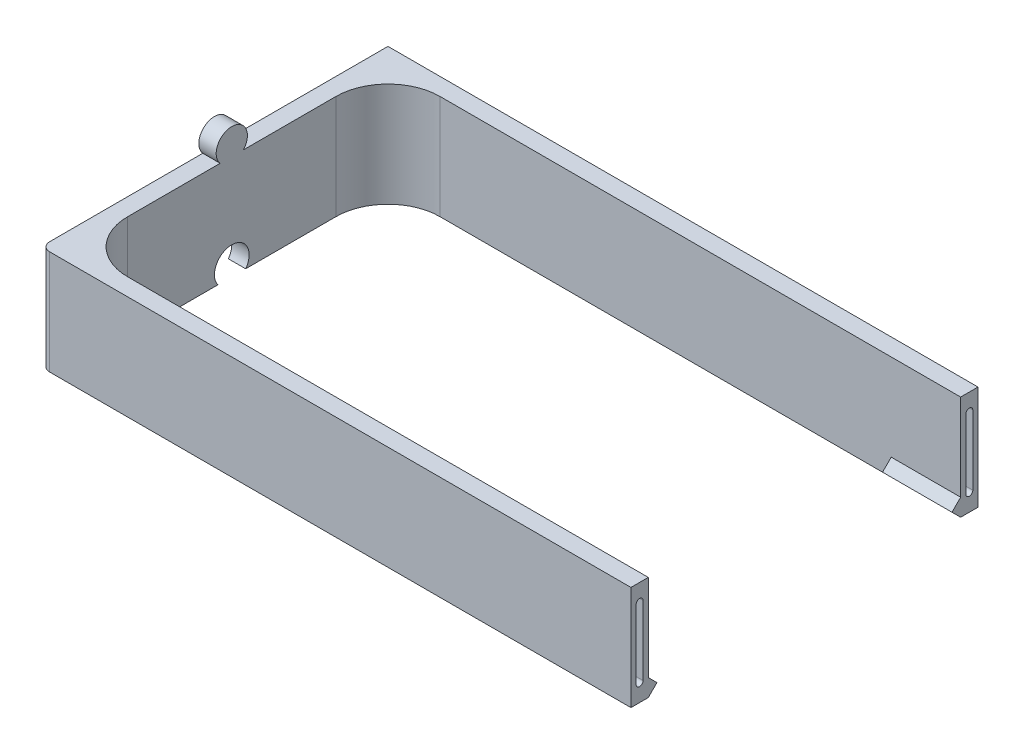
ISO-10303-21;
HEADER;
FILE_DESCRIPTION(('STEP AP214'),'2;1');
FILE_NAME('part.step','',(''),(''),'','','');
FILE_SCHEMA(('AUTOMOTIVE_DESIGN { 1 0 10303 214 1 1 1 1 }'));
ENDSEC;
DATA;
#1=APPLICATION_CONTEXT('core data for automotive mechanical design processes');
#2=APPLICATION_PROTOCOL_DEFINITION('international standard','automotive_design',2000,#1);
#3=PRODUCT_CONTEXT('',#1,'mechanical');
#4=PRODUCT('Part','Part','',(#3));
#5=PRODUCT_RELATED_PRODUCT_CATEGORY('part','',(#4));
#6=PRODUCT_DEFINITION_FORMATION('','',#4);
#7=PRODUCT_DEFINITION_CONTEXT('part definition',#1,'design');
#8=PRODUCT_DEFINITION('design','',#6,#7);
#9=PRODUCT_DEFINITION_SHAPE('','',#8);
#10=(LENGTH_UNIT() NAMED_UNIT(*) SI_UNIT(.MILLI.,.METRE.));
#11=(NAMED_UNIT(*) PLANE_ANGLE_UNIT() SI_UNIT($,.RADIAN.));
#12=(NAMED_UNIT(*) SI_UNIT($,.STERADIAN.) SOLID_ANGLE_UNIT());
#13=UNCERTAINTY_MEASURE_WITH_UNIT(LENGTH_MEASURE(1.E-05),#10,'distance_accuracy_value','');
#14=(GEOMETRIC_REPRESENTATION_CONTEXT(3) GLOBAL_UNCERTAINTY_ASSIGNED_CONTEXT((#13)) GLOBAL_UNIT_ASSIGNED_CONTEXT((#10,
#11,#12)) REPRESENTATION_CONTEXT('',''));
#15=CARTESIAN_POINT('',(0.,0.,0.));
#16=DIRECTION('',(0.,0.,1.));
#17=DIRECTION('',(1.,0.,0.));
#18=AXIS2_PLACEMENT_3D('',#15,#16,#17);
#19=CARTESIAN_POINT('',(2.5,30.,-2.5));
#20=DIRECTION('',(0.,-1.,0.));
#21=DIRECTION('',(0.,0.,-1.));
#22=AXIS2_PLACEMENT_3D('',#19,#20,#21);
#23=PLANE('',#22);
#24=DIRECTION('',(-1.,0.,0.));
#25=VECTOR('',#24,1.);
#26=CARTESIAN_POINT('',(5.,30.,-46.6458980337503));
#27=LINE('',#26,#25);
#28=CARTESIAN_POINT('',(0.,30.,-46.6458980337503));
#29=VERTEX_POINT('',#28);
#30=CARTESIAN_POINT('',(5.00000000000001,30.,-46.6458980337503));
#31=VERTEX_POINT('',#30);
#32=EDGE_CURVE('E234',#29,#31,#27,.F.);
#33=ORIENTED_EDGE('',*,*,#32,.F.);
#34=DIRECTION('',(0.,0.,1.));
#35=VECTOR('',#34,1.);
#36=CARTESIAN_POINT('',(0.,30.,-100.));
#37=LINE('',#36,#35);
#38=CARTESIAN_POINT('',(0.,30.,-2.50000000000002));
#39=VERTEX_POINT('',#38);
#40=EDGE_CURVE('E227',#29,#39,#37,.T.);
#41=ORIENTED_EDGE('',*,*,#40,.T.);
#42=CARTESIAN_POINT('',(2.5,30.,-2.5));
#43=DIRECTION('',(0.,1.,0.));
#44=DIRECTION('',(0.,0.,-1.));
#45=AXIS2_PLACEMENT_3D('',#42,#43,#44);
#46=CIRCLE('',#45,2.5);
#47=CARTESIAN_POINT('',(2.50000000000002,30.,0.));
#48=VERTEX_POINT('',#47);
#49=EDGE_CURVE('E413',#39,#48,#46,.T.);
#50=ORIENTED_EDGE('',*,*,#49,.T.);
#51=DIRECTION('',(1.,0.,0.));
#52=VECTOR('',#51,1.);
#53=CARTESIAN_POINT('',(2.50000000000002,30.,0.));
#54=LINE('',#53,#52);
#55=CARTESIAN_POINT('',(170.,30.,0.));
#56=VERTEX_POINT('',#55);
#57=EDGE_CURVE('E415',#48,#56,#54,.T.);
#58=ORIENTED_EDGE('',*,*,#57,.T.);
#59=DIRECTION('',(0.,0.,1.));
#60=VECTOR('',#59,1.);
#61=CARTESIAN_POINT('',(170.,30.,-2.5));
#62=LINE('',#61,#60);
#63=CARTESIAN_POINT('',(170.,30.,-5.));
#64=VERTEX_POINT('',#63);
#65=EDGE_CURVE('E318',#64,#56,#62,.T.);
#66=ORIENTED_EDGE('',*,*,#65,.F.);
#67=DIRECTION('',(1.,0.,0.));
#68=VECTOR('',#67,1.);
#69=CARTESIAN_POINT('',(20.0000000000001,30.,-5.));
#70=LINE('',#69,#68);
#71=CARTESIAN_POINT('',(20.0000000000001,30.,-5.));
#72=VERTEX_POINT('',#71);
#73=EDGE_CURVE('E386',#72,#64,#70,.T.);
#74=ORIENTED_EDGE('',*,*,#73,.F.);
#75=CARTESIAN_POINT('',(20.,30.,-20.));
#76=DIRECTION('',(0.,1.,0.));
#77=DIRECTION('',(0.,0.,-1.));
#78=AXIS2_PLACEMENT_3D('',#75,#76,#77);
#79=CIRCLE('',#78,15.);
#80=CARTESIAN_POINT('',(5.00000000000001,30.,-20.0000000000001));
#81=VERTEX_POINT('',#80);
#82=EDGE_CURVE('E383',#81,#72,#79,.T.);
#83=ORIENTED_EDGE('',*,*,#82,.F.);
#84=DIRECTION('',(0.,0.,1.));
#85=VECTOR('',#84,1.);
#86=CARTESIAN_POINT('',(5.,30.,-79.9999999999999));
#87=LINE('',#86,#85);
#88=EDGE_CURVE('E64',#31,#81,#87,.T.);
#89=ORIENTED_EDGE('',*,*,#88,.F.);
#90=EDGE_LOOP('',(#33,#41,#50,#58,#66,#74,#83,#89));
#91=FACE_BOUND('',#90,.T.);
#92=ADVANCED_FACE('F41',(#91),#23,.F.);
#93=DIRECTION('',(-1.,0.,0.));
#94=VECTOR('',#93,1.);
#95=CARTESIAN_POINT('',(5.,30.,-53.3541019662497));
#96=LINE('',#95,#94);
#97=CARTESIAN_POINT('',(5.00000000000001,30.,-53.3541019662497));
#98=VERTEX_POINT('',#97);
#99=CARTESIAN_POINT('',(0.,30.,-53.3541019662497));
#100=VERTEX_POINT('',#99);
#101=EDGE_CURVE('E239',#98,#100,#96,.T.);
#102=ORIENTED_EDGE('',*,*,#101,.F.);
#103=CARTESIAN_POINT('',(5.,30.,-79.9999999999999));
#104=VERTEX_POINT('',#103);
#105=EDGE_CURVE('E380',#104,#98,#87,.T.);
#106=ORIENTED_EDGE('',*,*,#105,.F.);
#107=CARTESIAN_POINT('',(20.,30.,-80.));
#108=DIRECTION('',(0.,1.,0.));
#109=DIRECTION('',(0.,0.,-1.));
#110=AXIS2_PLACEMENT_3D('',#107,#108,#109);
#111=CIRCLE('',#110,15.);
#112=CARTESIAN_POINT('',(20.,30.,-95.));
#113=VERTEX_POINT('',#112);
#114=EDGE_CURVE('E377',#113,#104,#111,.T.);
#115=ORIENTED_EDGE('',*,*,#114,.F.);
#116=DIRECTION('',(-1.,0.,0.));
#117=VECTOR('',#116,1.);
#118=CARTESIAN_POINT('',(20.0000000000001,30.,-95.));
#119=LINE('',#118,#117);
#120=CARTESIAN_POINT('',(170.,30.,-95.));
#121=VERTEX_POINT('',#120);
#122=EDGE_CURVE('E375',#121,#113,#119,.T.);
#123=ORIENTED_EDGE('',*,*,#122,.F.);
#124=CARTESIAN_POINT('',(170.,30.,-100.));
#125=VERTEX_POINT('',#124);
#126=EDGE_CURVE('E315',#125,#121,#62,.T.);
#127=ORIENTED_EDGE('',*,*,#126,.F.);
#128=DIRECTION('',(-1.,0.,0.));
#129=VECTOR('',#128,1.);
#130=CARTESIAN_POINT('',(2.50000000000002,30.,-100.));
#131=LINE('',#130,#129);
#132=CARTESIAN_POINT('',(0.,30.,-100.));
#133=VERTEX_POINT('',#132);
#134=EDGE_CURVE('E418',#125,#133,#131,.T.);
#135=ORIENTED_EDGE('',*,*,#134,.T.);
#136=EDGE_CURVE('E56',#133,#100,#37,.T.);
#137=ORIENTED_EDGE('',*,*,#136,.T.);
#138=EDGE_LOOP('',(#102,#106,#115,#123,#127,#135,#137));
#139=FACE_BOUND('',#138,.T.);
#140=ADVANCED_FACE('F464',(#139),#23,.F.);
#141=CARTESIAN_POINT('',(20.0000000000001,30.,-5.));
#142=DIRECTION('',(0.,0.,-1.));
#143=DIRECTION('',(-1.,0.,0.));
#144=AXIS2_PLACEMENT_3D('',#141,#142,#143);
#145=PLANE('',#144);
#146=ORIENTED_EDGE('',*,*,#73,.T.);
#147=DIRECTION('',(0.,-1.,0.));
#148=VECTOR('',#147,1.);
#149=CARTESIAN_POINT('',(170.,30.,-5.));
#150=LINE('',#149,#148);
#151=CARTESIAN_POINT('',(170.,5.,-5.));
#152=VERTEX_POINT('',#151);
#153=EDGE_CURVE('E317',#64,#152,#150,.T.);
#154=ORIENTED_EDGE('',*,*,#153,.T.);
#155=DIRECTION('',(1.,0.,0.));
#156=VECTOR('',#155,1.);
#157=CARTESIAN_POINT('',(150.,5.,-5.));
#158=LINE('',#157,#156);
#159=CARTESIAN_POINT('',(150.,5.00000000000001,-5.));
#160=VERTEX_POINT('',#159);
#161=EDGE_CURVE('E362',#160,#152,#158,.T.);
#162=ORIENTED_EDGE('',*,*,#161,.F.);
#163=DIRECTION('',(0.,-1.,0.));
#164=VECTOR('',#163,1.);
#165=CARTESIAN_POINT('',(150.,0.,-5.));
#166=LINE('',#165,#164);
#167=CARTESIAN_POINT('',(150.,0.,-5.));
#168=VERTEX_POINT('',#167);
#169=EDGE_CURVE('E355',#160,#168,#166,.T.);
#170=ORIENTED_EDGE('',*,*,#169,.T.);
#171=DIRECTION('',(1.,0.,0.));
#172=VECTOR('',#171,1.);
#173=CARTESIAN_POINT('',(20.0000000000001,0.,-5.));
#174=LINE('',#173,#172);
#175=CARTESIAN_POINT('',(20.0000000000001,0.,-5.));
#176=VERTEX_POINT('',#175);
#177=EDGE_CURVE('E378',#176,#168,#174,.T.);
#178=ORIENTED_EDGE('',*,*,#177,.F.);
#179=DIRECTION('',(0.,-1.,0.));
#180=VECTOR('',#179,1.);
#181=CARTESIAN_POINT('',(20.0000000000001,30.,-5.));
#182=LINE('',#181,#180);
#183=EDGE_CURVE('E389',#72,#176,#182,.T.);
#184=ORIENTED_EDGE('',*,*,#183,.F.);
#185=EDGE_LOOP('',(#146,#154,#162,#170,#178,#184));
#186=FACE_BOUND('',#185,.T.);
#187=ADVANCED_FACE('F451',(#186),#145,.T.);
#188=CARTESIAN_POINT('',(2.5,0.,-2.5));
#189=DIRECTION('',(0.,-1.,0.));
#190=DIRECTION('',(0.,0.,-1.));
#191=AXIS2_PLACEMENT_3D('',#188,#189,#190);
#192=PLANE('',#191);
#193=DIRECTION('',(-1.,0.,0.));
#194=VECTOR('',#193,1.);
#195=CARTESIAN_POINT('',(2.50000000000002,0.,-100.));
#196=LINE('',#195,#194);
#197=CARTESIAN_POINT('',(170.,0.,-100.));
#198=VERTEX_POINT('',#197);
#199=CARTESIAN_POINT('',(0.,0.,-100.));
#200=VERTEX_POINT('',#199);
#201=EDGE_CURVE('E232',#198,#200,#196,.T.);
#202=ORIENTED_EDGE('',*,*,#201,.F.);
#203=DIRECTION('',(0.,0.,1.));
#204=VECTOR('',#203,1.);
#205=CARTESIAN_POINT('',(170.,0.,0.));
#206=LINE('',#205,#204);
#207=CARTESIAN_POINT('',(170.,0.,-95.));
#208=VERTEX_POINT('',#207);
#209=EDGE_CURVE('E305',#198,#208,#206,.T.);
#210=ORIENTED_EDGE('',*,*,#209,.T.);
#211=DIRECTION('',(1.,0.,0.));
#212=VECTOR('',#211,1.);
#213=CARTESIAN_POINT('',(150.,0.,-95.));
#214=LINE('',#213,#212);
#215=CARTESIAN_POINT('',(150.,0.,-95.));
#216=VERTEX_POINT('',#215);
#217=EDGE_CURVE('E320',#216,#208,#214,.T.);
#218=ORIENTED_EDGE('',*,*,#217,.F.);
#219=DIRECTION('',(-1.,0.,0.));
#220=VECTOR('',#219,1.);
#221=CARTESIAN_POINT('',(20.0000000000001,0.,-95.));
#222=LINE('',#221,#220);
#223=CARTESIAN_POINT('',(20.,0.,-95.));
#224=VERTEX_POINT('',#223);
#225=EDGE_CURVE('E374',#216,#224,#222,.T.);
#226=ORIENTED_EDGE('',*,*,#225,.T.);
#227=CARTESIAN_POINT('',(20.,0.,-80.));
#228=DIRECTION('',(0.,1.,0.));
#229=DIRECTION('',(0.,0.,-1.));
#230=AXIS2_PLACEMENT_3D('',#227,#228,#229);
#231=CIRCLE('',#230,15.);
#232=CARTESIAN_POINT('',(5.,0.,-79.9999999999999));
#233=VERTEX_POINT('',#232);
#234=EDGE_CURVE('E391',#224,#233,#231,.T.);
#235=ORIENTED_EDGE('',*,*,#234,.T.);
#236=DIRECTION('',(0.,0.,1.));
#237=VECTOR('',#236,1.);
#238=CARTESIAN_POINT('',(5.,0.,-79.9999999999999));
#239=LINE('',#238,#237);
#240=CARTESIAN_POINT('',(5.,0.,-54.));
#241=VERTEX_POINT('',#240);
#242=EDGE_CURVE('E395',#233,#241,#239,.T.);
#243=ORIENTED_EDGE('',*,*,#242,.T.);
#244=DIRECTION('',(-1.,0.,0.));
#245=VECTOR('',#244,1.);
#246=CARTESIAN_POINT('',(30.,0.,-54.));
#247=LINE('',#246,#245);
#248=CARTESIAN_POINT('',(0.,0.,-54.));
#249=VERTEX_POINT('',#248);
#250=EDGE_CURVE('E368',#241,#249,#247,.T.);
#251=ORIENTED_EDGE('',*,*,#250,.T.);
#252=DIRECTION('',(0.,0.,1.));
#253=VECTOR('',#252,1.);
#254=CARTESIAN_POINT('',(0.,0.,-2.50000000000002));
#255=LINE('',#254,#253);
#256=EDGE_CURVE('E421',#200,#249,#255,.T.);
#257=ORIENTED_EDGE('',*,*,#256,.F.);
#258=EDGE_LOOP('',(#202,#210,#218,#226,#235,#243,#251,#257));
#259=FACE_BOUND('',#258,.T.);
#260=ADVANCED_FACE('F506',(#259),#192,.T.);
#261=DIRECTION('',(1.,0.,0.));
#262=VECTOR('',#261,1.);
#263=CARTESIAN_POINT('',(150.,0.,-5.));
#264=LINE('',#263,#262);
#265=CARTESIAN_POINT('',(170.,0.,-5.));
#266=VERTEX_POINT('',#265);
#267=EDGE_CURVE('E358',#168,#266,#264,.T.);
#268=ORIENTED_EDGE('',*,*,#267,.T.);
#269=CARTESIAN_POINT('',(170.,0.,0.));
#270=VERTEX_POINT('',#269);
#271=EDGE_CURVE('E277',#266,#270,#206,.T.);
#272=ORIENTED_EDGE('',*,*,#271,.T.);
#273=DIRECTION('',(1.,0.,0.));
#274=VECTOR('',#273,1.);
#275=CARTESIAN_POINT('',(2.50000000000002,0.,0.));
#276=LINE('',#275,#274);
#277=CARTESIAN_POINT('',(2.50000000000002,0.,0.));
#278=VERTEX_POINT('',#277);
#279=EDGE_CURVE('E426',#278,#270,#276,.T.);
#280=ORIENTED_EDGE('',*,*,#279,.F.);
#281=CARTESIAN_POINT('',(2.5,0.,-2.5));
#282=DIRECTION('',(0.,1.,0.));
#283=DIRECTION('',(0.,0.,-1.));
#284=AXIS2_PLACEMENT_3D('',#281,#282,#283);
#285=CIRCLE('',#284,2.5);
#286=CARTESIAN_POINT('',(0.,0.,-2.50000000000002));
#287=VERTEX_POINT('',#286);
#288=EDGE_CURVE('E424',#287,#278,#285,.T.);
#289=ORIENTED_EDGE('',*,*,#288,.F.);
#290=CARTESIAN_POINT('',(0.,0.,-46.));
#291=VERTEX_POINT('',#290);
#292=EDGE_CURVE('E411',#291,#287,#255,.T.);
#293=ORIENTED_EDGE('',*,*,#292,.F.);
#294=DIRECTION('',(-1.,0.,0.));
#295=VECTOR('',#294,1.);
#296=CARTESIAN_POINT('',(30.,0.,-46.));
#297=LINE('',#296,#295);
#298=CARTESIAN_POINT('',(5.00000000000001,0.,-46.));
#299=VERTEX_POINT('',#298);
#300=EDGE_CURVE('E371',#291,#299,#297,.F.);
#301=ORIENTED_EDGE('',*,*,#300,.T.);
#302=CARTESIAN_POINT('',(5.00000000000001,0.,-20.0000000000001));
#303=VERTEX_POINT('',#302);
#304=EDGE_CURVE('E394',#299,#303,#239,.T.);
#305=ORIENTED_EDGE('',*,*,#304,.T.);
#306=CARTESIAN_POINT('',(20.,0.,-20.));
#307=DIRECTION('',(0.,1.,0.));
#308=DIRECTION('',(0.,0.,-1.));
#309=AXIS2_PLACEMENT_3D('',#306,#307,#308);
#310=CIRCLE('',#309,15.);
#311=EDGE_CURVE('E398',#303,#176,#310,.T.);
#312=ORIENTED_EDGE('',*,*,#311,.T.);
#313=ORIENTED_EDGE('',*,*,#177,.T.);
#314=EDGE_LOOP('',(#268,#272,#280,#289,#293,#301,#305,#312,#313));
#315=FACE_BOUND('',#314,.T.);
#316=ADVANCED_FACE('F441',(#315),#192,.T.);
#317=CARTESIAN_POINT('',(2.50000000000002,30.,0.));
#318=DIRECTION('',(0.,0.,-1.));
#319=DIRECTION('',(-1.,0.,0.));
#320=AXIS2_PLACEMENT_3D('',#317,#318,#319);
#321=PLANE('',#320);
#322=DIRECTION('',(0.,-1.,0.));
#323=VECTOR('',#322,1.);
#324=CARTESIAN_POINT('',(170.,55.,0.));
#325=LINE('',#324,#323);
#326=EDGE_CURVE('E307',#56,#270,#325,.T.);
#327=ORIENTED_EDGE('',*,*,#326,.F.);
#328=ORIENTED_EDGE('',*,*,#57,.F.);
#329=DIRECTION('',(0.,-1.,0.));
#330=VECTOR('',#329,1.);
#331=CARTESIAN_POINT('',(2.50000000000002,30.,0.));
#332=LINE('',#331,#330);
#333=EDGE_CURVE('E432',#48,#278,#332,.T.);
#334=ORIENTED_EDGE('',*,*,#333,.T.);
#335=ORIENTED_EDGE('',*,*,#279,.T.);
#336=EDGE_LOOP('',(#327,#328,#334,#335));
#337=FACE_BOUND('',#336,.T.);
#338=ADVANCED_FACE('F445',(#337),#321,.F.);
#339=CARTESIAN_POINT('',(2.50000000000002,30.,-100.));
#340=DIRECTION('',(0.,0.,1.));
#341=DIRECTION('',(1.,0.,0.));
#342=AXIS2_PLACEMENT_3D('',#339,#340,#341);
#343=PLANE('',#342);
#344=DIRECTION('',(0.,-1.,0.));
#345=VECTOR('',#344,1.);
#346=CARTESIAN_POINT('',(170.,55.,-100.));
#347=LINE('',#346,#345);
#348=EDGE_CURVE('E309',#125,#198,#347,.T.);
#349=ORIENTED_EDGE('',*,*,#348,.T.);
#350=ORIENTED_EDGE('',*,*,#201,.T.);
#351=DIRECTION('',(0.,-1.,0.));
#352=VECTOR('',#351,1.);
#353=CARTESIAN_POINT('',(0.,30.,-100.));
#354=LINE('',#353,#352);
#355=EDGE_CURVE('E420',#133,#200,#354,.T.);
#356=ORIENTED_EDGE('',*,*,#355,.F.);
#357=ORIENTED_EDGE('',*,*,#134,.F.);
#358=EDGE_LOOP('',(#349,#350,#356,#357));
#359=FACE_BOUND('',#358,.T.);
#360=ADVANCED_FACE('F510',(#359),#343,.F.);
#361=CARTESIAN_POINT('',(20.0000000000001,30.,-95.));
#362=DIRECTION('',(0.,0.,1.));
#363=DIRECTION('',(1.,0.,0.));
#364=AXIS2_PLACEMENT_3D('',#361,#362,#363);
#365=PLANE('',#364);
#366=DIRECTION('',(1.,0.,0.));
#367=VECTOR('',#366,1.);
#368=CARTESIAN_POINT('',(150.,5.,-95.));
#369=LINE('',#368,#367);
#370=CARTESIAN_POINT('',(150.,5.,-95.));
#371=VERTEX_POINT('',#370);
#372=CARTESIAN_POINT('',(170.,5.,-95.));
#373=VERTEX_POINT('',#372);
#374=EDGE_CURVE('E324',#371,#373,#369,.T.);
#375=ORIENTED_EDGE('',*,*,#374,.T.);
#376=DIRECTION('',(0.,1.,0.));
#377=VECTOR('',#376,1.);
#378=CARTESIAN_POINT('',(170.,30.,-95.));
#379=LINE('',#378,#377);
#380=EDGE_CURVE('E312',#373,#121,#379,.T.);
#381=ORIENTED_EDGE('',*,*,#380,.T.);
#382=ORIENTED_EDGE('',*,*,#122,.T.);
#383=DIRECTION('',(0.,-1.,0.));
#384=VECTOR('',#383,1.);
#385=CARTESIAN_POINT('',(20.,30.,-95.));
#386=LINE('',#385,#384);
#387=EDGE_CURVE('E409',#113,#224,#386,.T.);
#388=ORIENTED_EDGE('',*,*,#387,.T.);
#389=ORIENTED_EDGE('',*,*,#225,.F.);
#390=DIRECTION('',(0.,1.,0.));
#391=VECTOR('',#390,1.);
#392=CARTESIAN_POINT('',(150.,0.,-95.));
#393=LINE('',#392,#391);
#394=EDGE_CURVE('E331',#216,#371,#393,.T.);
#395=ORIENTED_EDGE('',*,*,#394,.T.);
#396=EDGE_LOOP('',(#375,#381,#382,#388,#389,#395));
#397=FACE_BOUND('',#396,.T.);
#398=ADVANCED_FACE('F473',(#397),#365,.T.);
#399=CARTESIAN_POINT('',(0.,30.,-2.50000000000002));
#400=DIRECTION('',(1.,0.,0.));
#401=DIRECTION('',(0.,0.,-1.));
#402=AXIS2_PLACEMENT_3D('',#399,#400,#401);
#403=PLANE('',#402);
#404=ORIENTED_EDGE('',*,*,#40,.F.);
#405=CARTESIAN_POINT('',(0.,33.,-50.));
#406=DIRECTION('',(1.,0.,0.));
#407=DIRECTION('',(0.,0.,-1.));
#408=AXIS2_PLACEMENT_3D('',#405,#406,#407);
#409=CIRCLE('',#408,4.5);
#410=EDGE_CURVE('E229',#100,#29,#409,.T.);
#411=ORIENTED_EDGE('',*,*,#410,.F.);
#412=ORIENTED_EDGE('',*,*,#136,.F.);
#413=ORIENTED_EDGE('',*,*,#355,.T.);
#414=ORIENTED_EDGE('',*,*,#256,.T.);
#415=CARTESIAN_POINT('',(0.,3.00000000000001,-50.));
#416=DIRECTION('',(1.,0.,0.));
#417=DIRECTION('',(0.,0.,-1.));
#418=AXIS2_PLACEMENT_3D('',#415,#416,#417);
#419=CIRCLE('',#418,5.);
#420=EDGE_CURVE('E361',#249,#291,#419,.T.);
#421=ORIENTED_EDGE('',*,*,#420,.T.);
#422=ORIENTED_EDGE('',*,*,#292,.T.);
#423=DIRECTION('',(0.,-1.,0.));
#424=VECTOR('',#423,1.);
#425=CARTESIAN_POINT('',(0.,30.,-2.50000000000002));
#426=LINE('',#425,#424);
#427=EDGE_CURVE('E49',#39,#287,#426,.T.);
#428=ORIENTED_EDGE('',*,*,#427,.F.);
#429=EDGE_LOOP('',(#404,#411,#412,#413,#414,#421,#422,#428));
#430=FACE_BOUND('',#429,.T.);
#431=ADVANCED_FACE('F43',(#430),#403,.F.);
#432=CARTESIAN_POINT('',(2.5,30.,-2.5));
#433=DIRECTION('',(0.,-1.,0.));
#434=DIRECTION('',(0.,0.,-1.));
#435=AXIS2_PLACEMENT_3D('',#432,#433,#434);
#436=CYLINDRICAL_SURFACE('',#435,2.5);
#437=ORIENTED_EDGE('',*,*,#288,.T.);
#438=ORIENTED_EDGE('',*,*,#333,.F.);
#439=ORIENTED_EDGE('',*,*,#49,.F.);
#440=ORIENTED_EDGE('',*,*,#427,.T.);
#441=EDGE_LOOP('',(#437,#438,#439,#440));
#442=FACE_BOUND('',#441,.T.);
#443=ADVANCED_FACE('F436',(#442),#436,.T.);
#444=CARTESIAN_POINT('',(20.,30.,-80.));
#445=DIRECTION('',(0.,-1.,0.));
#446=DIRECTION('',(0.,0.,-1.));
#447=AXIS2_PLACEMENT_3D('',#444,#445,#446);
#448=CYLINDRICAL_SURFACE('',#447,15.);
#449=ORIENTED_EDGE('',*,*,#234,.F.);
#450=ORIENTED_EDGE('',*,*,#387,.F.);
#451=ORIENTED_EDGE('',*,*,#114,.T.);
#452=DIRECTION('',(0.,-1.,0.));
#453=VECTOR('',#452,1.);
#454=CARTESIAN_POINT('',(5.,30.,-79.9999999999999));
#455=LINE('',#454,#453);
#456=EDGE_CURVE('E407',#104,#233,#455,.T.);
#457=ORIENTED_EDGE('',*,*,#456,.T.);
#458=EDGE_LOOP('',(#449,#450,#451,#457));
#459=FACE_BOUND('',#458,.T.);
#460=ADVANCED_FACE('F470',(#459),#448,.F.);
#461=CARTESIAN_POINT('',(5.,30.,-79.9999999999999));
#462=DIRECTION('',(1.,0.,0.));
#463=DIRECTION('',(0.,0.,-1.));
#464=AXIS2_PLACEMENT_3D('',#461,#462,#463);
#465=PLANE('',#464);
#466=ORIENTED_EDGE('',*,*,#105,.T.);
#467=CARTESIAN_POINT('',(5.,33.,-50.));
#468=DIRECTION('',(1.,0.,0.));
#469=DIRECTION('',(0.,0.,-1.));
#470=AXIS2_PLACEMENT_3D('',#467,#468,#469);
#471=CIRCLE('',#470,4.5);
#472=EDGE_CURVE('E242',#98,#31,#471,.T.);
#473=ORIENTED_EDGE('',*,*,#472,.T.);
#474=ORIENTED_EDGE('',*,*,#88,.T.);
#475=DIRECTION('',(0.,-1.,0.));
#476=VECTOR('',#475,1.);
#477=CARTESIAN_POINT('',(5.00000000000001,30.,-20.0000000000001));
#478=LINE('',#477,#476);
#479=EDGE_CURVE('E404',#81,#303,#478,.T.);
#480=ORIENTED_EDGE('',*,*,#479,.T.);
#481=ORIENTED_EDGE('',*,*,#304,.F.);
#482=CARTESIAN_POINT('',(5.,3.00000000000001,-50.));
#483=DIRECTION('',(1.,0.,0.));
#484=DIRECTION('',(0.,0.,-1.));
#485=AXIS2_PLACEMENT_3D('',#482,#483,#484);
#486=CIRCLE('',#485,5.);
#487=EDGE_CURVE('E11',#299,#241,#486,.F.);
#488=ORIENTED_EDGE('',*,*,#487,.T.);
#489=ORIENTED_EDGE('',*,*,#242,.F.);
#490=ORIENTED_EDGE('',*,*,#456,.F.);
#491=EDGE_LOOP('',(#466,#473,#474,#480,#481,#488,#489,#490));
#492=FACE_BOUND('',#491,.T.);
#493=ADVANCED_FACE('F459',(#492),#465,.T.);
#494=CARTESIAN_POINT('',(20.,30.,-20.));
#495=DIRECTION('',(0.,-1.,0.));
#496=DIRECTION('',(0.,0.,-1.));
#497=AXIS2_PLACEMENT_3D('',#494,#495,#496);
#498=CYLINDRICAL_SURFACE('',#497,15.);
#499=ORIENTED_EDGE('',*,*,#311,.F.);
#500=ORIENTED_EDGE('',*,*,#479,.F.);
#501=ORIENTED_EDGE('',*,*,#82,.T.);
#502=ORIENTED_EDGE('',*,*,#183,.T.);
#503=EDGE_LOOP('',(#499,#500,#501,#502));
#504=FACE_BOUND('',#503,.T.);
#505=ADVANCED_FACE('F456',(#504),#498,.F.);
#506=CARTESIAN_POINT('',(30.,3.00000000000001,-50.));
#507=DIRECTION('',(-1.,0.,0.));
#508=DIRECTION('',(0.,0.,1.));
#509=AXIS2_PLACEMENT_3D('',#506,#507,#508);
#510=CYLINDRICAL_SURFACE('',#509,5.);
#511=ORIENTED_EDGE('',*,*,#420,.F.);
#512=ORIENTED_EDGE('',*,*,#250,.F.);
#513=ORIENTED_EDGE('',*,*,#487,.F.);
#514=ORIENTED_EDGE('',*,*,#300,.F.);
#515=EDGE_LOOP('',(#511,#512,#513,#514));
#516=FACE_BOUND('',#515,.T.);
#517=ADVANCED_FACE('F582',(#516),#510,.F.);
#518=CARTESIAN_POINT('',(150.,2.5,-7.50000000000005));
#519=DIRECTION('',(0.,-0.707106781186554,-0.707106781186541));
#520=DIRECTION('',(0.,0.707106781186541,-0.707106781186554));
#521=AXIS2_PLACEMENT_3D('',#518,#519,#520);
#522=PLANE('',#521);
#523=DIRECTION('',(1.,0.,0.));
#524=VECTOR('',#523,1.);
#525=CARTESIAN_POINT('',(150.,2.5,-7.50000000000005));
#526=LINE('',#525,#524);
#527=CARTESIAN_POINT('',(150.,2.5,-7.50000000000005));
#528=VERTEX_POINT('',#527);
#529=CARTESIAN_POINT('',(170.,2.5,-7.50000000000005));
#530=VERTEX_POINT('',#529);
#531=EDGE_CURVE('E357',#528,#530,#526,.T.);
#532=ORIENTED_EDGE('',*,*,#531,.T.);
#533=DIRECTION('',(0.,0.707106781186541,-0.707106781186554));
#534=VECTOR('',#533,1.);
#535=CARTESIAN_POINT('',(170.,2.5,-7.50000000000005));
#536=LINE('',#535,#534);
#537=EDGE_CURVE('E343',#266,#530,#536,.T.);
#538=ORIENTED_EDGE('',*,*,#537,.F.);
#539=ORIENTED_EDGE('',*,*,#267,.F.);
#540=DIRECTION('',(0.,0.707106781186541,-0.707106781186554));
#541=VECTOR('',#540,1.);
#542=CARTESIAN_POINT('',(150.,2.5,-7.50000000000005));
#543=LINE('',#542,#541);
#544=EDGE_CURVE('E349',#168,#528,#543,.T.);
#545=ORIENTED_EDGE('',*,*,#544,.T.);
#546=EDGE_LOOP('',(#532,#538,#539,#545));
#547=FACE_BOUND('',#546,.T.);
#548=ADVANCED_FACE('F587',(#547),#522,.T.);
#549=CARTESIAN_POINT('',(150.,5.,-5.));
#550=DIRECTION('',(0.,0.707106781186554,-0.707106781186541));
#551=DIRECTION('',(0.,0.707106781186541,0.707106781186554));
#552=AXIS2_PLACEMENT_3D('',#549,#550,#551);
#553=PLANE('',#552);
#554=ORIENTED_EDGE('',*,*,#161,.T.);
#555=DIRECTION('',(0.,0.707106781186541,0.707106781186554));
#556=VECTOR('',#555,1.);
#557=CARTESIAN_POINT('',(170.,5.,-5.));
#558=LINE('',#557,#556);
#559=EDGE_CURVE('E346',#530,#152,#558,.T.);
#560=ORIENTED_EDGE('',*,*,#559,.F.);
#561=ORIENTED_EDGE('',*,*,#531,.F.);
#562=DIRECTION('',(0.,0.707106781186541,0.707106781186554));
#563=VECTOR('',#562,1.);
#564=CARTESIAN_POINT('',(150.,5.,-5.));
#565=LINE('',#564,#563);
#566=EDGE_CURVE('E352',#528,#160,#565,.T.);
#567=ORIENTED_EDGE('',*,*,#566,.T.);
#568=EDGE_LOOP('',(#554,#560,#561,#567));
#569=FACE_BOUND('',#568,.T.);
#570=ADVANCED_FACE('F571',(#569),#553,.T.);
#571=CARTESIAN_POINT('',(150.,0.,0.));
#572=DIRECTION('',(1.,0.,0.));
#573=DIRECTION('',(0.,0.,-1.));
#574=AXIS2_PLACEMENT_3D('',#571,#572,#573);
#575=PLANE('',#574);
#576=ORIENTED_EDGE('',*,*,#544,.F.);
#577=ORIENTED_EDGE('',*,*,#169,.F.);
#578=ORIENTED_EDGE('',*,*,#566,.F.);
#579=EDGE_LOOP('',(#576,#577,#578));
#580=FACE_BOUND('',#579,.T.);
#581=ADVANCED_FACE('F565',(#580),#575,.F.);
#582=CARTESIAN_POINT('',(170.,0.,0.));
#583=DIRECTION('',(1.,0.,0.));
#584=DIRECTION('',(0.,0.,-1.));
#585=AXIS2_PLACEMENT_3D('',#582,#583,#584);
#586=PLANE('',#585);
#587=CARTESIAN_POINT('',(170.,25.,-2.5));
#588=DIRECTION('',(1.,0.,0.));
#589=DIRECTION('',(0.,0.,-1.));
#590=AXIS2_PLACEMENT_3D('',#587,#588,#589);
#591=CIRCLE('',#590,1.);
#592=CARTESIAN_POINT('',(170.,25.,-3.5));
#593=VERTEX_POINT('',#592);
#594=CARTESIAN_POINT('',(170.,25.,-1.5));
#595=VERTEX_POINT('',#594);
#596=EDGE_CURVE('E262',#593,#595,#591,.T.);
#597=ORIENTED_EDGE('',*,*,#596,.F.);
#598=DIRECTION('',(0.,1.,0.));
#599=VECTOR('',#598,1.);
#600=CARTESIAN_POINT('',(170.,0.,-3.5));
#601=LINE('',#600,#599);
#602=CARTESIAN_POINT('',(170.,5.,-3.5));
#603=VERTEX_POINT('',#602);
#604=EDGE_CURVE('E260',#603,#593,#601,.T.);
#605=ORIENTED_EDGE('',*,*,#604,.F.);
#606=CARTESIAN_POINT('',(170.,5.,-2.5));
#607=DIRECTION('',(1.,0.,0.));
#608=DIRECTION('',(0.,0.,-1.));
#609=AXIS2_PLACEMENT_3D('',#606,#607,#608);
#610=CIRCLE('',#609,1.);
#611=CARTESIAN_POINT('',(170.,5.,-1.5));
#612=VERTEX_POINT('',#611);
#613=EDGE_CURVE('E267',#612,#603,#610,.T.);
#614=ORIENTED_EDGE('',*,*,#613,.F.);
#615=DIRECTION('',(0.,1.,0.));
#616=VECTOR('',#615,1.);
#617=CARTESIAN_POINT('',(170.,0.,-1.5));
#618=LINE('',#617,#616);
#619=EDGE_CURVE('E264',#612,#595,#618,.T.);
#620=ORIENTED_EDGE('',*,*,#619,.T.);
#621=EDGE_LOOP('',(#597,#605,#614,#620));
#622=FACE_BOUND('',#621,.T.);
#623=ORIENTED_EDGE('',*,*,#537,.T.);
#624=ORIENTED_EDGE('',*,*,#559,.T.);
#625=ORIENTED_EDGE('',*,*,#153,.F.);
#626=ORIENTED_EDGE('',*,*,#65,.T.);
#627=ORIENTED_EDGE('',*,*,#326,.T.);
#628=ORIENTED_EDGE('',*,*,#271,.F.);
#629=EDGE_LOOP('',(#623,#624,#625,#626,#627,#628));
#630=FACE_BOUND('',#629,.T.);
#631=ADVANCED_FACE('F570',(#622,#630),#586,.T.);
#632=CARTESIAN_POINT('',(150.,2.5,-92.5));
#633=DIRECTION('',(0.,-0.707106781186554,0.707106781186541));
#634=DIRECTION('',(0.,-0.707106781186541,-0.707106781186554));
#635=AXIS2_PLACEMENT_3D('',#632,#633,#634);
#636=PLANE('',#635);
#637=ORIENTED_EDGE('',*,*,#217,.T.);
#638=DIRECTION('',(0.,-0.707106781186541,-0.707106781186554));
#639=VECTOR('',#638,1.);
#640=CARTESIAN_POINT('',(170.,2.5,-92.5));
#641=LINE('',#640,#639);
#642=CARTESIAN_POINT('',(170.,2.5,-92.5));
#643=VERTEX_POINT('',#642);
#644=EDGE_CURVE('E340',#643,#208,#641,.T.);
#645=ORIENTED_EDGE('',*,*,#644,.F.);
#646=DIRECTION('',(1.,0.,0.));
#647=VECTOR('',#646,1.);
#648=CARTESIAN_POINT('',(150.,2.5,-92.5));
#649=LINE('',#648,#647);
#650=CARTESIAN_POINT('',(150.,2.5,-92.5));
#651=VERTEX_POINT('',#650);
#652=EDGE_CURVE('E327',#651,#643,#649,.T.);
#653=ORIENTED_EDGE('',*,*,#652,.F.);
#654=DIRECTION('',(0.,-0.707106781186541,-0.707106781186554));
#655=VECTOR('',#654,1.);
#656=CARTESIAN_POINT('',(150.,2.5,-92.5));
#657=LINE('',#656,#655);
#658=EDGE_CURVE('E334',#651,#216,#657,.T.);
#659=ORIENTED_EDGE('',*,*,#658,.T.);
#660=EDGE_LOOP('',(#637,#645,#653,#659));
#661=FACE_BOUND('',#660,.T.);
#662=ADVANCED_FACE('F484',(#661),#636,.T.);
#663=CARTESIAN_POINT('',(150.,5.,-95.));
#664=DIRECTION('',(0.,0.707106781186554,0.707106781186541));
#665=DIRECTION('',(0.,-0.707106781186541,0.707106781186554));
#666=AXIS2_PLACEMENT_3D('',#663,#664,#665);
#667=PLANE('',#666);
#668=ORIENTED_EDGE('',*,*,#652,.T.);
#669=DIRECTION('',(0.,-0.707106781186541,0.707106781186554));
#670=VECTOR('',#669,1.);
#671=CARTESIAN_POINT('',(170.,5.,-95.));
#672=LINE('',#671,#670);
#673=EDGE_CURVE('E337',#373,#643,#672,.T.);
#674=ORIENTED_EDGE('',*,*,#673,.F.);
#675=ORIENTED_EDGE('',*,*,#374,.F.);
#676=DIRECTION('',(0.,-0.707106781186541,0.707106781186554));
#677=VECTOR('',#676,1.);
#678=CARTESIAN_POINT('',(150.,5.,-95.));
#679=LINE('',#678,#677);
#680=EDGE_CURVE('E323',#371,#651,#679,.T.);
#681=ORIENTED_EDGE('',*,*,#680,.T.);
#682=EDGE_LOOP('',(#668,#674,#675,#681));
#683=FACE_BOUND('',#682,.T.);
#684=ADVANCED_FACE('F480',(#683),#667,.T.);
#685=CARTESIAN_POINT('',(150.,0.,0.));
#686=DIRECTION('',(-1.,0.,0.));
#687=DIRECTION('',(0.,0.,1.));
#688=AXIS2_PLACEMENT_3D('',#685,#686,#687);
#689=PLANE('',#688);
#690=ORIENTED_EDGE('',*,*,#658,.F.);
#691=ORIENTED_EDGE('',*,*,#680,.F.);
#692=ORIENTED_EDGE('',*,*,#394,.F.);
#693=EDGE_LOOP('',(#690,#691,#692));
#694=FACE_BOUND('',#693,.T.);
#695=ADVANCED_FACE('F486',(#694),#689,.T.);
#696=CARTESIAN_POINT('',(170.,0.,0.));
#697=DIRECTION('',(-1.,0.,0.));
#698=DIRECTION('',(0.,0.,1.));
#699=AXIS2_PLACEMENT_3D('',#696,#697,#698);
#700=PLANE('',#699);
#701=DIRECTION('',(0.,1.,0.));
#702=VECTOR('',#701,1.);
#703=CARTESIAN_POINT('',(170.,0.,-98.5));
#704=LINE('',#703,#702);
#705=CARTESIAN_POINT('',(170.,5.,-98.5));
#706=VERTEX_POINT('',#705);
#707=CARTESIAN_POINT('',(170.,25.,-98.5));
#708=VERTEX_POINT('',#707);
#709=EDGE_CURVE('E289',#706,#708,#704,.T.);
#710=ORIENTED_EDGE('',*,*,#709,.F.);
#711=CARTESIAN_POINT('',(170.,5.,-97.5));
#712=DIRECTION('',(1.,0.,0.));
#713=DIRECTION('',(0.,0.,-1.));
#714=AXIS2_PLACEMENT_3D('',#711,#712,#713);
#715=CIRCLE('',#714,1.);
#716=CARTESIAN_POINT('',(170.,5.,-96.5));
#717=VERTEX_POINT('',#716);
#718=EDGE_CURVE('E296',#717,#706,#715,.T.);
#719=ORIENTED_EDGE('',*,*,#718,.F.);
#720=DIRECTION('',(0.,1.,0.));
#721=VECTOR('',#720,1.);
#722=CARTESIAN_POINT('',(170.,0.,-96.5));
#723=LINE('',#722,#721);
#724=CARTESIAN_POINT('',(170.,25.,-96.5));
#725=VERTEX_POINT('',#724);
#726=EDGE_CURVE('E293',#717,#725,#723,.T.);
#727=ORIENTED_EDGE('',*,*,#726,.T.);
#728=CARTESIAN_POINT('',(170.,25.,-97.5));
#729=DIRECTION('',(1.,0.,0.));
#730=DIRECTION('',(0.,0.,-1.));
#731=AXIS2_PLACEMENT_3D('',#728,#729,#730);
#732=CIRCLE('',#731,1.);
#733=EDGE_CURVE('E291',#708,#725,#732,.T.);
#734=ORIENTED_EDGE('',*,*,#733,.F.);
#735=EDGE_LOOP('',(#710,#719,#727,#734));
#736=FACE_BOUND('',#735,.T.);
#737=ORIENTED_EDGE('',*,*,#644,.T.);
#738=ORIENTED_EDGE('',*,*,#209,.F.);
#739=ORIENTED_EDGE('',*,*,#348,.F.);
#740=ORIENTED_EDGE('',*,*,#126,.T.);
#741=ORIENTED_EDGE('',*,*,#380,.F.);
#742=ORIENTED_EDGE('',*,*,#673,.T.);
#743=EDGE_LOOP('',(#737,#738,#739,#740,#741,#742));
#744=FACE_BOUND('',#743,.T.);
#745=ADVANCED_FACE('F477',(#736,#744),#700,.F.);
#746=CARTESIAN_POINT('',(170.,0.,-98.5));
#747=DIRECTION('',(0.,0.,1.));
#748=DIRECTION('',(1.,0.,0.));
#749=AXIS2_PLACEMENT_3D('',#746,#747,#748);
#750=PLANE('',#749);
#751=DIRECTION('',(-1.,0.,0.));
#752=VECTOR('',#751,1.);
#753=CARTESIAN_POINT('',(170.,5.,-98.5));
#754=LINE('',#753,#752);
#755=CARTESIAN_POINT('',(155.,5.,-98.5));
#756=VERTEX_POINT('',#755);
#757=EDGE_CURVE('E298',#706,#756,#754,.T.);
#758=ORIENTED_EDGE('',*,*,#757,.F.);
#759=ORIENTED_EDGE('',*,*,#709,.T.);
#760=DIRECTION('',(-1.,0.,0.));
#761=VECTOR('',#760,1.);
#762=CARTESIAN_POINT('',(170.,25.,-98.5));
#763=LINE('',#762,#761);
#764=CARTESIAN_POINT('',(155.,25.,-98.5));
#765=VERTEX_POINT('',#764);
#766=EDGE_CURVE('E251',#708,#765,#763,.T.);
#767=ORIENTED_EDGE('',*,*,#766,.T.);
#768=DIRECTION('',(0.,1.,0.));
#769=VECTOR('',#768,1.);
#770=CARTESIAN_POINT('',(155.,0.,-98.5));
#771=LINE('',#770,#769);
#772=EDGE_CURVE('E238',#756,#765,#771,.T.);
#773=ORIENTED_EDGE('',*,*,#772,.F.);
#774=EDGE_LOOP('',(#758,#759,#767,#773));
#775=FACE_BOUND('',#774,.T.);
#776=ADVANCED_FACE('F493',(#775),#750,.T.);
#777=CARTESIAN_POINT('',(170.,25.,-97.5));
#778=DIRECTION('',(-1.,0.,0.));
#779=DIRECTION('',(0.,0.,1.));
#780=AXIS2_PLACEMENT_3D('',#777,#778,#779);
#781=CYLINDRICAL_SURFACE('',#780,1.);
#782=ORIENTED_EDGE('',*,*,#766,.F.);
#783=ORIENTED_EDGE('',*,*,#733,.T.);
#784=DIRECTION('',(-1.,0.,0.));
#785=VECTOR('',#784,1.);
#786=CARTESIAN_POINT('',(170.,25.,-96.5));
#787=LINE('',#786,#785);
#788=CARTESIAN_POINT('',(155.,25.,-96.5));
#789=VERTEX_POINT('',#788);
#790=EDGE_CURVE('E302',#725,#789,#787,.T.);
#791=ORIENTED_EDGE('',*,*,#790,.T.);
#792=CARTESIAN_POINT('',(155.,25.,-97.5));
#793=DIRECTION('',(1.,0.,0.));
#794=DIRECTION('',(0.,0.,-1.));
#795=AXIS2_PLACEMENT_3D('',#792,#793,#794);
#796=CIRCLE('',#795,1.);
#797=EDGE_CURVE('E280',#765,#789,#796,.T.);
#798=ORIENTED_EDGE('',*,*,#797,.F.);
#799=EDGE_LOOP('',(#782,#783,#791,#798));
#800=FACE_BOUND('',#799,.T.);
#801=ADVANCED_FACE('F737',(#800),#781,.F.);
#802=CARTESIAN_POINT('',(170.,0.,-96.5));
#803=DIRECTION('',(0.,0.,1.));
#804=DIRECTION('',(1.,0.,0.));
#805=AXIS2_PLACEMENT_3D('',#802,#803,#804);
#806=PLANE('',#805);
#807=ORIENTED_EDGE('',*,*,#790,.F.);
#808=ORIENTED_EDGE('',*,*,#726,.F.);
#809=DIRECTION('',(-1.,0.,0.));
#810=VECTOR('',#809,1.);
#811=CARTESIAN_POINT('',(170.,5.,-96.5));
#812=LINE('',#811,#810);
#813=CARTESIAN_POINT('',(155.,5.,-96.5));
#814=VERTEX_POINT('',#813);
#815=EDGE_CURVE('E300',#717,#814,#812,.T.);
#816=ORIENTED_EDGE('',*,*,#815,.T.);
#817=DIRECTION('',(0.,1.,0.));
#818=VECTOR('',#817,1.);
#819=CARTESIAN_POINT('',(155.,0.,-96.5));
#820=LINE('',#819,#818);
#821=EDGE_CURVE('E283',#814,#789,#820,.T.);
#822=ORIENTED_EDGE('',*,*,#821,.T.);
#823=EDGE_LOOP('',(#807,#808,#816,#822));
#824=FACE_BOUND('',#823,.T.);
#825=ADVANCED_FACE('F727',(#824),#806,.F.);
#826=CARTESIAN_POINT('',(170.,5.,-97.5));
#827=DIRECTION('',(-1.,0.,0.));
#828=DIRECTION('',(0.,0.,1.));
#829=AXIS2_PLACEMENT_3D('',#826,#827,#828);
#830=CYLINDRICAL_SURFACE('',#829,1.);
#831=ORIENTED_EDGE('',*,*,#815,.F.);
#832=ORIENTED_EDGE('',*,*,#718,.T.);
#833=ORIENTED_EDGE('',*,*,#757,.T.);
#834=CARTESIAN_POINT('',(155.,5.,-97.5));
#835=DIRECTION('',(1.,0.,0.));
#836=DIRECTION('',(0.,0.,-1.));
#837=AXIS2_PLACEMENT_3D('',#834,#835,#836);
#838=CIRCLE('',#837,1.);
#839=EDGE_CURVE('E286',#814,#756,#838,.T.);
#840=ORIENTED_EDGE('',*,*,#839,.F.);
#841=EDGE_LOOP('',(#831,#832,#833,#840));
#842=FACE_BOUND('',#841,.T.);
#843=ADVANCED_FACE('F718',(#842),#830,.F.);
#844=CARTESIAN_POINT('',(155.,0.,0.));
#845=DIRECTION('',(1.,0.,0.));
#846=DIRECTION('',(0.,0.,-1.));
#847=AXIS2_PLACEMENT_3D('',#844,#845,#846);
#848=PLANE('',#847);
#849=ORIENTED_EDGE('',*,*,#772,.T.);
#850=ORIENTED_EDGE('',*,*,#797,.T.);
#851=ORIENTED_EDGE('',*,*,#821,.F.);
#852=ORIENTED_EDGE('',*,*,#839,.T.);
#853=EDGE_LOOP('',(#849,#850,#851,#852));
#854=FACE_BOUND('',#853,.T.);
#855=ADVANCED_FACE('F707',(#854),#848,.T.);
#856=CARTESIAN_POINT('',(170.,0.,-3.5));
#857=DIRECTION('',(0.,0.,1.));
#858=DIRECTION('',(0.,-1.,0.));
#859=AXIS2_PLACEMENT_3D('',#856,#857,#858);
#860=PLANE('',#859);
#861=DIRECTION('',(-1.,0.,0.));
#862=VECTOR('',#861,1.);
#863=CARTESIAN_POINT('',(170.,5.,-3.5));
#864=LINE('',#863,#862);
#865=CARTESIAN_POINT('',(155.,5.,-3.5));
#866=VERTEX_POINT('',#865);
#867=EDGE_CURVE('E269',#603,#866,#864,.T.);
#868=ORIENTED_EDGE('',*,*,#867,.F.);
#869=ORIENTED_EDGE('',*,*,#604,.T.);
#870=DIRECTION('',(-1.,0.,0.));
#871=VECTOR('',#870,1.);
#872=CARTESIAN_POINT('',(170.,25.,-3.5));
#873=LINE('',#872,#871);
#874=CARTESIAN_POINT('',(155.,25.,-3.5));
#875=VERTEX_POINT('',#874);
#876=EDGE_CURVE('E275',#593,#875,#873,.T.);
#877=ORIENTED_EDGE('',*,*,#876,.T.);
#878=DIRECTION('',(0.,1.,0.));
#879=VECTOR('',#878,1.);
#880=CARTESIAN_POINT('',(155.,0.,-3.5));
#881=LINE('',#880,#879);
#882=EDGE_CURVE('E247',#866,#875,#881,.T.);
#883=ORIENTED_EDGE('',*,*,#882,.F.);
#884=EDGE_LOOP('',(#868,#869,#877,#883));
#885=FACE_BOUND('',#884,.T.);
#886=ADVANCED_FACE('F697',(#885),#860,.T.);
#887=CARTESIAN_POINT('',(170.,25.,-2.5));
#888=DIRECTION('',(-1.,0.,0.));
#889=DIRECTION('',(0.,0.,1.));
#890=AXIS2_PLACEMENT_3D('',#887,#888,#889);
#891=CYLINDRICAL_SURFACE('',#890,1.);
#892=ORIENTED_EDGE('',*,*,#876,.F.);
#893=ORIENTED_EDGE('',*,*,#596,.T.);
#894=DIRECTION('',(-1.,0.,0.));
#895=VECTOR('',#894,1.);
#896=CARTESIAN_POINT('',(170.,25.,-1.5));
#897=LINE('',#896,#895);
#898=CARTESIAN_POINT('',(155.,25.,-1.5));
#899=VERTEX_POINT('',#898);
#900=EDGE_CURVE('E273',#595,#899,#897,.T.);
#901=ORIENTED_EDGE('',*,*,#900,.T.);
#902=CARTESIAN_POINT('',(155.,25.,-2.5));
#903=DIRECTION('',(1.,0.,0.));
#904=DIRECTION('',(0.,0.,-1.));
#905=AXIS2_PLACEMENT_3D('',#902,#903,#904);
#906=CIRCLE('',#905,1.);
#907=EDGE_CURVE('E250',#875,#899,#906,.T.);
#908=ORIENTED_EDGE('',*,*,#907,.F.);
#909=EDGE_LOOP('',(#892,#893,#901,#908));
#910=FACE_BOUND('',#909,.T.);
#911=ADVANCED_FACE('F687',(#910),#891,.F.);
#912=CARTESIAN_POINT('',(170.,0.,-1.5));
#913=DIRECTION('',(0.,0.,1.));
#914=DIRECTION('',(0.,-1.,0.));
#915=AXIS2_PLACEMENT_3D('',#912,#913,#914);
#916=PLANE('',#915);
#917=ORIENTED_EDGE('',*,*,#900,.F.);
#918=ORIENTED_EDGE('',*,*,#619,.F.);
#919=DIRECTION('',(-1.,0.,0.));
#920=VECTOR('',#919,1.);
#921=CARTESIAN_POINT('',(170.,5.,-1.5));
#922=LINE('',#921,#920);
#923=CARTESIAN_POINT('',(155.,5.,-1.5));
#924=VERTEX_POINT('',#923);
#925=EDGE_CURVE('E271',#612,#924,#922,.T.);
#926=ORIENTED_EDGE('',*,*,#925,.T.);
#927=DIRECTION('',(0.,1.,0.));
#928=VECTOR('',#927,1.);
#929=CARTESIAN_POINT('',(155.,0.,-1.5));
#930=LINE('',#929,#928);
#931=EDGE_CURVE('E254',#924,#899,#930,.T.);
#932=ORIENTED_EDGE('',*,*,#931,.T.);
#933=EDGE_LOOP('',(#917,#918,#926,#932));
#934=FACE_BOUND('',#933,.T.);
#935=ADVANCED_FACE('F677',(#934),#916,.F.);
#936=CARTESIAN_POINT('',(170.,5.,-2.5));
#937=DIRECTION('',(-1.,0.,0.));
#938=DIRECTION('',(0.,0.,1.));
#939=AXIS2_PLACEMENT_3D('',#936,#937,#938);
#940=CYLINDRICAL_SURFACE('',#939,1.);
#941=ORIENTED_EDGE('',*,*,#925,.F.);
#942=ORIENTED_EDGE('',*,*,#613,.T.);
#943=ORIENTED_EDGE('',*,*,#867,.T.);
#944=CARTESIAN_POINT('',(155.,5.,-2.5));
#945=DIRECTION('',(1.,0.,0.));
#946=DIRECTION('',(0.,0.,-1.));
#947=AXIS2_PLACEMENT_3D('',#944,#945,#946);
#948=CIRCLE('',#947,1.);
#949=EDGE_CURVE('E257',#924,#866,#948,.T.);
#950=ORIENTED_EDGE('',*,*,#949,.F.);
#951=EDGE_LOOP('',(#941,#942,#943,#950));
#952=FACE_BOUND('',#951,.T.);
#953=ADVANCED_FACE('F668',(#952),#940,.F.);
#954=CARTESIAN_POINT('',(155.,0.,0.));
#955=DIRECTION('',(1.,0.,0.));
#956=DIRECTION('',(0.,0.,-1.));
#957=AXIS2_PLACEMENT_3D('',#954,#955,#956);
#958=PLANE('',#957);
#959=ORIENTED_EDGE('',*,*,#882,.T.);
#960=ORIENTED_EDGE('',*,*,#907,.T.);
#961=ORIENTED_EDGE('',*,*,#931,.F.);
#962=ORIENTED_EDGE('',*,*,#949,.T.);
#963=EDGE_LOOP('',(#959,#960,#961,#962));
#964=FACE_BOUND('',#963,.T.);
#965=ADVANCED_FACE('F648',(#964),#958,.T.);
#966=CARTESIAN_POINT('',(5.,33.,-50.));
#967=DIRECTION('',(-1.,0.,0.));
#968=DIRECTION('',(0.,0.,1.));
#969=AXIS2_PLACEMENT_3D('',#966,#967,#968);
#970=CYLINDRICAL_SURFACE('',#969,4.5);
#971=ORIENTED_EDGE('',*,*,#410,.T.);
#972=ORIENTED_EDGE('',*,*,#32,.T.);
#973=ORIENTED_EDGE('',*,*,#472,.F.);
#974=ORIENTED_EDGE('',*,*,#101,.T.);
#975=EDGE_LOOP('',(#971,#972,#973,#974));
#976=FACE_BOUND('',#975,.T.);
#977=ADVANCED_FACE('F241',(#976),#970,.T.);
#978=CLOSED_SHELL('',(#92,#140,#187,#260,#316,#338,#360,#398,#431,#443,#460,#493,#505,#517,#548,
#570,#581,#631,#662,#684,#695,#745,#776,#801,#825,#843,#855,#886,#911,#935,#953,#965,#977));
#979=MANIFOLD_SOLID_BREP('B2',#978);
#980=ADVANCED_BREP_SHAPE_REPRESENTATION('',(#18,#979),#14);
#981=SHAPE_DEFINITION_REPRESENTATION(#9,#980);
ENDSEC;
END-ISO-10303-21;
